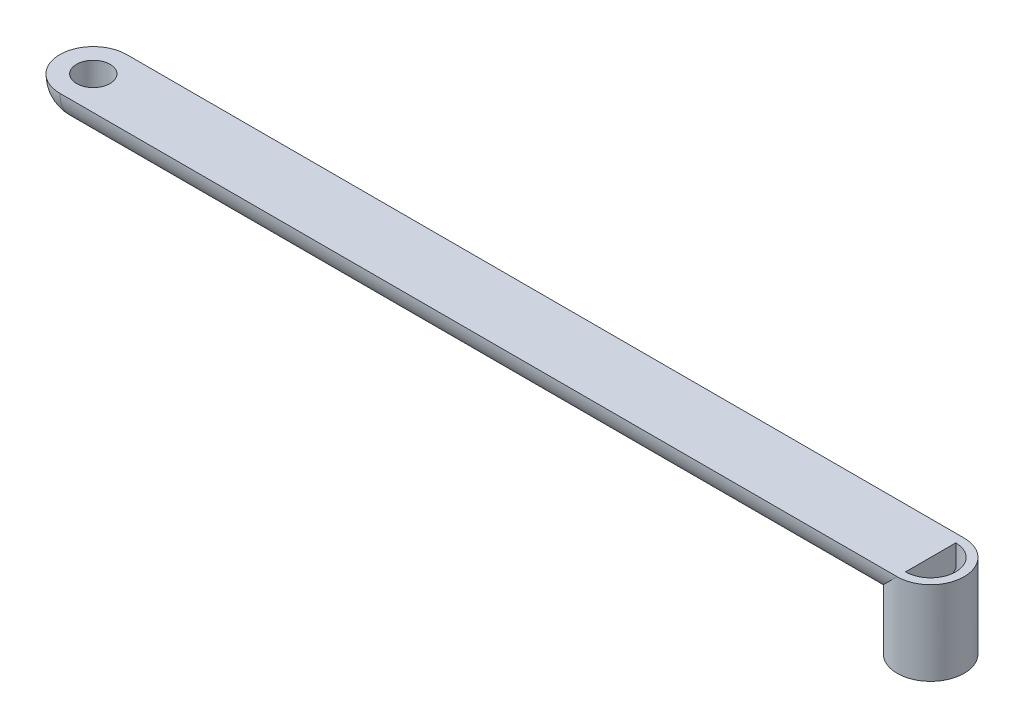
ISO-10303-21;
HEADER;
FILE_DESCRIPTION(('STEP AP214'),'2;1');
FILE_NAME('part.step','',(''),(''),'','','');
FILE_SCHEMA(('AUTOMOTIVE_DESIGN { 1 0 10303 214 1 1 1 1 }'));
ENDSEC;
DATA;
#1=APPLICATION_CONTEXT('core data for automotive mechanical design processes');
#2=APPLICATION_PROTOCOL_DEFINITION('international standard','automotive_design',2000,#1);
#3=PRODUCT_CONTEXT('',#1,'mechanical');
#4=PRODUCT('Part','Part','',(#3));
#5=PRODUCT_RELATED_PRODUCT_CATEGORY('part','',(#4));
#6=PRODUCT_DEFINITION_FORMATION('','',#4);
#7=PRODUCT_DEFINITION_CONTEXT('part definition',#1,'design');
#8=PRODUCT_DEFINITION('design','',#6,#7);
#9=PRODUCT_DEFINITION_SHAPE('','',#8);
#10=(LENGTH_UNIT() NAMED_UNIT(*) SI_UNIT(.MILLI.,.METRE.));
#11=(NAMED_UNIT(*) PLANE_ANGLE_UNIT() SI_UNIT($,.RADIAN.));
#12=(NAMED_UNIT(*) SI_UNIT($,.STERADIAN.) SOLID_ANGLE_UNIT());
#13=UNCERTAINTY_MEASURE_WITH_UNIT(LENGTH_MEASURE(1.E-05),#10,'distance_accuracy_value','');
#14=(GEOMETRIC_REPRESENTATION_CONTEXT(3) GLOBAL_UNCERTAINTY_ASSIGNED_CONTEXT((#13)) GLOBAL_UNIT_ASSIGNED_CONTEXT((#10,
#11,#12)) REPRESENTATION_CONTEXT('',''));
#15=CARTESIAN_POINT('',(0.,0.,0.));
#16=DIRECTION('',(0.,0.,1.));
#17=DIRECTION('',(1.,0.,0.));
#18=AXIS2_PLACEMENT_3D('',#15,#16,#17);
#19=CARTESIAN_POINT('',(0.,50.,0.));
#20=DIRECTION('',(0.,1.,0.));
#21=DIRECTION('',(0.,0.,1.));
#22=AXIS2_PLACEMENT_3D('',#19,#20,#21);
#23=CYLINDRICAL_SURFACE('',#22,20.);
#24=CARTESIAN_POINT('',(0.,0.,0.));
#25=DIRECTION('',(0.,1.,0.));
#26=DIRECTION('',(0.,0.,1.));
#27=AXIS2_PLACEMENT_3D('',#24,#25,#26);
#28=CIRCLE('',#27,20.);
#29=CARTESIAN_POINT('',(0.,0.,20.));
#30=VERTEX_POINT('',#29);
#31=EDGE_CURVE('E163',#30,#30,#28,.T.);
#32=ORIENTED_EDGE('',*,*,#31,.T.);
#33=EDGE_LOOP('',(#32));
#34=FACE_BOUND('',#33,.T.);
#35=CARTESIAN_POINT('',(0.,50.,0.));
#36=DIRECTION('',(-0.707106781186548,0.707106781186547,0.));
#37=DIRECTION('',(0.707106781186547,0.707106781186548,0.));
#38=AXIS2_PLACEMENT_3D('',#35,#36,#37);
#39=ELLIPSE('',#38,28.2842712474619,20.);
#40=CARTESIAN_POINT('',(0.,50.0000000000001,-20.0000000000001));
#41=VERTEX_POINT('',#40);
#42=CARTESIAN_POINT('',(0.,50.,20.));
#43=VERTEX_POINT('',#42);
#44=EDGE_CURVE('E108',#41,#43,#39,.T.);
#45=ORIENTED_EDGE('',*,*,#44,.F.);
#46=CARTESIAN_POINT('',(0.,50.,0.));
#47=DIRECTION('',(0.,1.,0.));
#48=DIRECTION('',(0.,0.,1.));
#49=AXIS2_PLACEMENT_3D('',#46,#47,#48);
#50=CIRCLE('',#49,20.);
#51=EDGE_CURVE('E167',#43,#41,#50,.T.);
#52=ORIENTED_EDGE('',*,*,#51,.F.);
#53=EDGE_LOOP('',(#45,#52));
#54=FACE_BOUND('',#53,.T.);
#55=ADVANCED_FACE('F37',(#34,#54),#23,.T.);
#56=CARTESIAN_POINT('',(0.,50.,0.));
#57=DIRECTION('',(0.,1.,0.));
#58=DIRECTION('',(0.,0.,1.));
#59=AXIS2_PLACEMENT_3D('',#56,#57,#58);
#60=CYLINDRICAL_SURFACE('',#59,15.);
#61=DIRECTION('',(0.,1.,0.));
#62=VECTOR('',#61,1.);
#63=CARTESIAN_POINT('',(0.,50.,-15.));
#64=LINE('',#63,#62);
#65=CARTESIAN_POINT('',(0.,36.771243444677,-15.));
#66=VERTEX_POINT('',#65);
#67=CARTESIAN_POINT('',(0.,50.,-15.));
#68=VERTEX_POINT('',#67);
#69=EDGE_CURVE('E59',#66,#68,#64,.T.);
#70=ORIENTED_EDGE('',*,*,#69,.F.);
#71=CARTESIAN_POINT('',(0.,36.771243444677,-15.));
#72=CARTESIAN_POINT('',(-0.176733878906073,36.7712629463075,-15.0000079735266));
#73=CARTESIAN_POINT('',(-0.353459882850591,36.767702246076,-14.99687673945));
#74=CARTESIAN_POINT('',(-0.706382472485033,36.7535654233469,-14.9843963189759));
#75=CARTESIAN_POINT('',(-0.882579141740371,36.7429904737367,-14.9750481721383));
#76=CARTESIAN_POINT('',(-1.23363053180858,36.7149986117996,-14.9502196912227));
#77=CARTESIAN_POINT('',(-1.40848725636122,36.6975956947333,-14.9347519000172));
#78=CARTESIAN_POINT('',(-1.75677034083064,36.6562252984173,-14.897799857157));
#79=CARTESIAN_POINT('',(-1.93019665769643,36.6322576223254,-14.8763154250947));
#80=CARTESIAN_POINT('',(-2.44328217942834,36.55170322785,-14.8036672501449));
#81=CARTESIAN_POINT('',(-2.78038223865948,36.4860785795133,-14.7439736943787));
#82=CARTESIAN_POINT('',(-3.44519942425923,36.3338208535488,-14.6029534549164));
#83=CARTESIAN_POINT('',(-3.77291196512252,36.2471776982993,-14.5216163921151));
#84=CARTESIAN_POINT('',(-4.41479897701609,36.0573604970292,-14.3394542201581));
#85=CARTESIAN_POINT('',(-4.72906171167426,35.9543262680818,-14.2387925700737));
#86=CARTESIAN_POINT('',(-5.34602691503038,35.7347675133727,-14.0188186022798));
#87=CARTESIAN_POINT('',(-5.64873053468124,35.6182443354017,-13.8995081475079));
#88=CARTESIAN_POINT('',(-6.24332320539639,35.3744989661203,-13.6428058299157));
#89=CARTESIAN_POINT('',(-6.53517016813653,35.2472403518448,-13.5053514389101));
#90=CARTESIAN_POINT('',(-7.10680777867469,34.9852679448747,-13.2134890618355));
#91=CARTESIAN_POINT('',(-7.3865965713478,34.8505530122716,-13.0590784799646));
#92=CARTESIAN_POINT('',(-7.99087229496329,34.5477458698984,-12.7001495410012));
#93=CARTESIAN_POINT('',(-8.31257620714151,34.3785317376843,-12.4918843601087));
#94=CARTESIAN_POINT('',(-8.9380338824212,34.036922223484,-12.052289114329));
#95=CARTESIAN_POINT('',(-9.24178623097383,33.8645265922027,-11.8209572356795));
#96=CARTESIAN_POINT('',(-9.83104386427943,33.5199426311072,-11.3356217900065));
#97=CARTESIAN_POINT('',(-10.1165402170005,33.3477544426034,-11.0816072686079));
#98=CARTESIAN_POINT('',(-10.6683947672444,33.0068369210706,-10.5513878476987));
#99=CARTESIAN_POINT('',(-10.9347513743794,32.8381078763045,-10.2751811081896));
#100=CARTESIAN_POINT('',(-11.4998212871325,32.4731557904509,-9.64205182525309));
#101=CARTESIAN_POINT('',(-11.7939757239875,32.2783864262411,-9.28018943425487));
#102=CARTESIAN_POINT('',(-12.3504681521328,31.9032639452068,-8.52559136582214));
#103=CARTESIAN_POINT('',(-12.6127989675482,31.7229140829347,-8.13284875802294));
#104=CARTESIAN_POINT('',(-13.101960183433,31.3819800349645,-7.31872600131997));
#105=CARTESIAN_POINT('',(-13.3288513408535,31.2213621244934,-6.89739668038329));
#106=CARTESIAN_POINT('',(-13.743906310598,30.9245204394303,-6.02799667662743));
#107=CARTESIAN_POINT('',(-13.9320906161465,30.7882837612595,-5.5799403073097));
#108=CARTESIAN_POINT('',(-14.2155218255108,30.5815873488256,-4.79953907301783));
#109=CARTESIAN_POINT('',(-14.3216773449766,30.5036845773899,-4.47307882444002));
#110=CARTESIAN_POINT('',(-14.5120028402441,30.3634505513707,-3.81057296775454));
#111=CARTESIAN_POINT('',(-14.5961780606442,30.3011155823943,-3.47452966747119));
#112=CARTESIAN_POINT('',(-14.7413793560126,30.1932863941751,-2.79505763114002));
#113=CARTESIAN_POINT('',(-14.8024213570907,30.1477805893843,-2.45163414874145));
#114=CARTESIAN_POINT('',(-14.9005501331646,30.0745056081502,-1.75948027006187));
#115=CARTESIAN_POINT('',(-14.9376360493555,30.0467370675726,-1.41074968398447));
#116=CARTESIAN_POINT('',(-14.987335702051,30.0095032907172,-0.709643323367877));
#117=CARTESIAN_POINT('',(-14.9998847993223,30.0000863998194,-0.357260372584957));
#118=CARTESIAN_POINT('',(-15.0001136184122,29.9999147868796,0.347516865404779));
#119=CARTESIAN_POINT('',(-14.9877934383938,30.0091599911755,0.699911152561359));
#120=CARTESIAN_POINT('',(-14.9384782654607,30.0461064621876,1.40205505403781));
#121=CARTESIAN_POINT('',(-14.9014783982485,30.0738113747395,1.75180413211965));
#122=CARTESIAN_POINT('',(-14.803377765454,30.1470674722445,2.44599532638162));
#123=CARTESIAN_POINT('',(-14.7422771600251,30.1926185386069,2.79043747781131));
#124=CARTESIAN_POINT('',(-14.5993801140693,30.2987387558888,3.4599457294934));
#125=CARTESIAN_POINT('',(-14.5183676329562,30.3587375864787,3.78527081562633));
#126=CARTESIAN_POINT('',(-14.3357363666305,30.4933465351639,4.42695679816696));
#127=CARTESIAN_POINT('',(-14.2341182017195,30.5679562134204,4.74331796409268));
#128=CARTESIAN_POINT('',(-14.0114122857969,30.7304935268366,5.36558937026337));
#129=CARTESIAN_POINT('',(-13.8903232894865,30.8184220138083,5.6714989405358));
#130=CARTESIAN_POINT('',(-13.6298619969652,31.0061854118989,6.27167491763578));
#131=CARTESIAN_POINT('',(-13.4904872074764,31.1060219465176,6.56593972955935));
#132=CARTESIAN_POINT('',(-13.1786248888202,31.3274848578472,7.17304449030048));
#133=CARTESIAN_POINT('',(-13.0041861878223,31.4503000893887,7.48444820743945));
#134=CARTESIAN_POINT('',(-12.6358191012628,31.7066561815177,8.09085688682627));
#135=CARTESIAN_POINT('',(-12.4418895245203,31.8401976975396,8.38586084509282));
#136=CARTESIAN_POINT('',(-12.0357738206923,32.1159955830716,8.95899421930461));
#137=CARTESIAN_POINT('',(-11.8235772678145,32.2582569158593,9.23711384211268));
#138=CARTESIAN_POINT('',(-11.3821605044448,32.5493253559616,9.77587473017112));
#139=CARTESIAN_POINT('',(-11.1529385748191,32.6981331236809,10.0365142252992));
#140=CARTESIAN_POINT('',(-10.6317779192735,33.029829299738,10.5894585457902));
#141=CARTESIAN_POINT('',(-10.3363646309976,33.2136700766106,10.8779255755101));
#142=CARTESIAN_POINT('',(-9.72364948908711,33.5838576285037,11.4289306243139));
#143=CARTESIAN_POINT('',(-9.4063433890214,33.7702048840175,11.6914635889569));
#144=CARTESIAN_POINT('',(-8.75026382444806,34.1414423169824,12.1902786993343));
#145=CARTESIAN_POINT('',(-8.41146747151905,34.3263306968297,12.4265320927569));
#146=CARTESIAN_POINT('',(-7.71314486943709,34.6897521333979,12.8716274622872));
#147=CARTESIAN_POINT('',(-7.35362336556698,34.868286629898,13.0804756775567));
#148=CARTESIAN_POINT('',(-6.6866087676077,35.1796856192033,13.4313823561329));
#149=CARTESIAN_POINT('',(-6.38274940460065,35.3146373989577,13.5785051115813));
#150=CARTESIAN_POINT('',(-5.76184175330657,35.5736623003155,13.8533906597262));
#151=CARTESIAN_POINT('',(-5.44479340437268,35.6977353718873,13.9811533633869));
#152=CARTESIAN_POINT('',(-4.79938040537522,35.9307455472113,14.2156000926108));
#153=CARTESIAN_POINT('',(-4.47107413181974,36.0397492699787,14.3223778347324));
#154=CARTESIAN_POINT('',(-3.80266784504565,36.2392333206624,14.514147506704));
#155=CARTESIAN_POINT('',(-3.4625715785396,36.329719471261,14.5991462868761));
#156=CARTESIAN_POINT('',(-2.8665646375323,36.4664286417922,14.72578013653));
#157=CARTESIAN_POINT('',(-2.61303598520628,36.5179907575124,14.7729180929866));
#158=CARTESIAN_POINT('',(-2.1016185871534,36.6077098491905,14.8542996683176));
#159=CARTESIAN_POINT('',(-1.84373121105964,36.6458709569568,14.8885472617922));
#160=CARTESIAN_POINT('',(-1.32252349260597,36.7078316003608,14.9438987427059));
#161=CARTESIAN_POINT('',(-1.05917543129359,36.731503748805,14.9648860963534));
#162=CARTESIAN_POINT('',(-0.530568679832663,36.7632649744925,14.9929628636197));
#163=CARTESIAN_POINT('',(-0.265308458124138,36.7713397316467,15.0000395058087));
#164=CARTESIAN_POINT('',(0.,36.771243444677,15.));
#165=B_SPLINE_CURVE_WITH_KNOTS('',3,(#71,#72,#73,#74,#75,#76,#77,#78,#79,#80,#81,#82,#83,#84,
#85,#86,#87,#88,#89,#90,#91,#92,#93,#94,#95,#96,#97,#98,#99,#100,#101,#102,#103,#104,#105,#106,
#107,#108,#109,#110,#111,#112,#113,#114,#115,#116,#117,#118,#119,#120,#121,#122,#123,#124,#125,
#126,#127,#128,#129,#130,#131,#132,#133,#134,#135,#136,#137,#138,#139,#140,#141,#142,#143,#144,
#145,#146,#147,#148,#149,#150,#151,#152,#153,#154,#155,#156,#157,#158,#159,#160,#161,#162,#163,
#164),.UNSPECIFIED.,.F.,.F.,(4,2,2,2,2,2,2,2,2,2,2,2,2,2,2,2,2,2,2,2,2,2,2,2,2,2,2,2,2,2,2,2,2,
2,2,2,2,2,2,2,2,2,2,2,2,2,4),(0.,0.530124843038199,1.06016106362168,1.58911649932432,
2.1180877973325,3.16210629169382,4.20662634835101,5.24267226984869,6.278614760764,
7.31822539874029,8.35799541186728,9.61368105309862,10.8694655083892,12.1258597476022,
13.3823582645358,14.8964120882855,16.4108066823381,17.9225758416887,19.4335425274133,
20.4885392857365,21.5432840865818,22.5973014214589,23.6513565398439,24.7081847154544,
25.7650087196039,26.8220415108654,27.8790672780936,28.8997433019992,29.920388604622,
30.9410992107892,31.9619491363287,33.0932783941059,34.2246768349383,35.3567253526752,
36.4888883345694,37.8434598261574,39.198294799359,40.5545978040985,41.9105914902808,
43.0005068424092,44.090427206845,45.1753636074489,46.2599583336944,47.048270176175,
47.8363387519495,48.6312400834306,49.4268708739208),.UNSPECIFIED.);
#166=CARTESIAN_POINT('',(0.,36.771243444677,15.));
#167=VERTEX_POINT('',#166);
#168=EDGE_CURVE('E111',#66,#167,#165,.T.);
#169=ORIENTED_EDGE('',*,*,#168,.T.);
#170=DIRECTION('',(0.,1.,0.));
#171=VECTOR('',#170,1.);
#172=CARTESIAN_POINT('',(0.,50.,15.));
#173=LINE('',#172,#171);
#174=CARTESIAN_POINT('',(0.,50.,15.));
#175=VERTEX_POINT('',#174);
#176=EDGE_CURVE('E99',#175,#167,#173,.F.);
#177=ORIENTED_EDGE('',*,*,#176,.F.);
#178=CARTESIAN_POINT('',(0.,50.,0.));
#179=DIRECTION('',(0.,1.,0.));
#180=DIRECTION('',(0.,0.,1.));
#181=AXIS2_PLACEMENT_3D('',#178,#179,#180);
#182=CIRCLE('',#181,15.);
#183=EDGE_CURVE('E118',#175,#68,#182,.T.);
#184=ORIENTED_EDGE('',*,*,#183,.T.);
#185=EDGE_LOOP('',(#70,#169,#177,#184));
#186=FACE_BOUND('',#185,.T.);
#187=CARTESIAN_POINT('',(0.,0.,0.));
#188=DIRECTION('',(0.,1.,0.));
#189=DIRECTION('',(0.,0.,1.));
#190=AXIS2_PLACEMENT_3D('',#187,#188,#189);
#191=CIRCLE('',#190,15.);
#192=CARTESIAN_POINT('',(0.,0.,15.));
#193=VERTEX_POINT('',#192);
#194=EDGE_CURVE('E46',#193,#193,#191,.T.);
#195=ORIENTED_EDGE('',*,*,#194,.F.);
#196=EDGE_LOOP('',(#195));
#197=FACE_BOUND('',#196,.T.);
#198=ADVANCED_FACE('F39',(#186,#197),#60,.F.);
#199=CARTESIAN_POINT('',(0.,0.,0.));
#200=DIRECTION('',(0.,1.,0.));
#201=DIRECTION('',(0.,0.,1.));
#202=AXIS2_PLACEMENT_3D('',#199,#200,#201);
#203=PLANE('',#202);
#204=ORIENTED_EDGE('',*,*,#31,.F.);
#205=EDGE_LOOP('',(#204));
#206=FACE_BOUND('',#205,.T.);
#207=ORIENTED_EDGE('',*,*,#194,.T.);
#208=EDGE_LOOP('',(#207));
#209=FACE_BOUND('',#208,.T.);
#210=ADVANCED_FACE('F152',(#206,#209),#203,.F.);
#211=CARTESIAN_POINT('',(0.,50.,0.));
#212=DIRECTION('',(0.,-1.,0.));
#213=DIRECTION('',(0.,0.,-1.));
#214=AXIS2_PLACEMENT_3D('',#211,#212,#213);
#215=PLANE('',#214);
#216=CARTESIAN_POINT('',(-500.,50.,0.));
#217=DIRECTION('',(0.,1.,0.));
#218=DIRECTION('',(0.,0.,1.));
#219=AXIS2_PLACEMENT_3D('',#216,#217,#218);
#220=CIRCLE('',#219,9.99999999999998);
#221=CARTESIAN_POINT('',(-500.,50.,9.99999999999998));
#222=VERTEX_POINT('',#221);
#223=EDGE_CURVE('E92',#222,#222,#220,.T.);
#224=ORIENTED_EDGE('',*,*,#223,.F.);
#225=EDGE_LOOP('',(#224));
#226=FACE_BOUND('',#225,.T.);
#227=ORIENTED_EDGE('',*,*,#183,.F.);
#228=DIRECTION('',(0.,0.,1.));
#229=VECTOR('',#228,1.);
#230=CARTESIAN_POINT('',(0.,50.0000000000002,50.));
#231=LINE('',#230,#229);
#232=EDGE_CURVE('E101',#68,#175,#231,.T.);
#233=ORIENTED_EDGE('',*,*,#232,.F.);
#234=EDGE_LOOP('',(#227,#233));
#235=FACE_BOUND('',#234,.T.);
#236=ORIENTED_EDGE('',*,*,#51,.T.);
#237=DIRECTION('',(1.,0.,0.));
#238=VECTOR('',#237,1.);
#239=CARTESIAN_POINT('',(0.,50.0000000000001,-20.0000000000001));
#240=LINE('',#239,#238);
#241=CARTESIAN_POINT('',(-500.,50.,-20.));
#242=VERTEX_POINT('',#241);
#243=EDGE_CURVE('E178',#242,#41,#240,.T.);
#244=ORIENTED_EDGE('',*,*,#243,.F.);
#245=CARTESIAN_POINT('',(-500.,49.9999999999999,0.));
#246=DIRECTION('',(0.,1.,0.));
#247=DIRECTION('',(0.,0.,1.));
#248=AXIS2_PLACEMENT_3D('',#245,#246,#247);
#249=CIRCLE('',#248,20.);
#250=CARTESIAN_POINT('',(-500.,49.9999999999999,20.));
#251=VERTEX_POINT('',#250);
#252=EDGE_CURVE('E91',#242,#251,#249,.T.);
#253=ORIENTED_EDGE('',*,*,#252,.T.);
#254=DIRECTION('',(1.,0.,0.));
#255=VECTOR('',#254,1.);
#256=CARTESIAN_POINT('',(0.,50.0000000000001,20.0000000000001));
#257=LINE('',#256,#255);
#258=EDGE_CURVE('E177',#251,#43,#257,.T.);
#259=ORIENTED_EDGE('',*,*,#258,.T.);
#260=EDGE_LOOP('',(#236,#244,#253,#259));
#261=FACE_BOUND('',#260,.T.);
#262=ADVANCED_FACE('F128',(#226,#235,#261),#215,.F.);
#263=CARTESIAN_POINT('',(0.,50.,0.));
#264=DIRECTION('',(1.,0.,0.));
#265=DIRECTION('',(0.,1.,0.));
#266=AXIS2_PLACEMENT_3D('',#263,#264,#265);
#267=CYLINDRICAL_SURFACE('',#266,20.);
#268=CARTESIAN_POINT('',(-500.,49.9999999999999,0.));
#269=DIRECTION('',(1.,0.,0.));
#270=DIRECTION('',(0.,1.,0.));
#271=AXIS2_PLACEMENT_3D('',#268,#269,#270);
#272=CIRCLE('',#271,20.);
#273=CARTESIAN_POINT('',(-500.,32.6794919243111,9.99999999999996));
#274=VERTEX_POINT('',#273);
#275=EDGE_CURVE('E90',#251,#274,#272,.T.);
#276=ORIENTED_EDGE('',*,*,#275,.T.);
#277=CARTESIAN_POINT('',(-500.,32.6794919243111,9.99999999999998));
#278=CARTESIAN_POINT('',(-499.869051811282,32.6794949358604,10.0000009842124));
#279=CARTESIAN_POINT('',(-499.73812209713,32.6780062939064,9.99742732625386));
#280=CARTESIAN_POINT('',(-499.476538198109,32.6720765567724,9.98714776425289));
#281=CARTESIAN_POINT('',(-499.345883998772,32.6676356206991,9.97944213678537));
#282=CARTESIAN_POINT('',(-498.954891273438,32.6499403583364,9.94866974837695));
#283=CARTESIAN_POINT('',(-498.695300981241,32.6323134750299,9.91794741881241));
#284=CARTESIAN_POINT('',(-498.18180403485,32.5861904155684,9.83673629740468));
#285=CARTESIAN_POINT('',(-497.927873332549,32.5577571154028,9.78636180553135));
#286=CARTESIAN_POINT('',(-497.425878337959,32.4910251137871,9.66646257715092));
#287=CARTESIAN_POINT('',(-497.177814723062,32.4527252791947,9.59693564097865));
#288=CARTESIAN_POINT('',(-496.689709508798,32.3676320454643,9.4396801648658));
#289=CARTESIAN_POINT('',(-496.449650116678,32.3208592118166,9.35199562450872));
#290=CARTESIAN_POINT('',(-495.978165484807,32.22017892349,9.15913679566111));
#291=CARTESIAN_POINT('',(-495.746743640962,32.1662686998021,9.05395571516241));
#292=CARTESIAN_POINT('',(-495.066681423949,31.9959704891028,8.7131797976528));
#293=CARTESIAN_POINT('',(-494.632519977552,31.8710658548499,8.4524420310276));
#294=CARTESIAN_POINT('',(-493.776765603735,31.6002663996642,7.84654710730719));
#295=CARTESIAN_POINT('',(-493.359104888229,31.4534903548212,7.49622958837881));
#296=CARTESIAN_POINT('',(-492.77914764027,31.2354409979818,6.92338914550209));
#297=CARTESIAN_POINT('',(-492.593483414635,31.1630660583375,6.72441003875209));
#298=CARTESIAN_POINT('',(-492.238627390106,31.0207355255137,6.31150716738825));
#299=CARTESIAN_POINT('',(-492.069429645124,30.9507790649431,6.09758884564932));
#300=CARTESIAN_POINT('',(-491.737632513399,30.8103514720671,5.64077173064866));
#301=CARTESIAN_POINT('',(-491.576260944162,30.7401678358448,5.39689141389571));
#302=CARTESIAN_POINT('',(-491.274796784082,30.606420658317,4.89455061133216));
#303=CARTESIAN_POINT('',(-491.13470542006,30.5428574987541,4.63608928609078));
#304=CARTESIAN_POINT('',(-490.877253080332,30.4242123381422,4.1063567704925));
#305=CARTESIAN_POINT('',(-490.759881255945,30.3691262918227,3.83509177129906));
#306=CARTESIAN_POINT('',(-490.549137810231,30.2690550475659,3.28159507983375));
#307=CARTESIAN_POINT('',(-490.455763637626,30.2240687759487,2.99936455702265));
#308=CARTESIAN_POINT('',(-490.299971819808,30.1483941887775,2.44661833360222));
#309=CARTESIAN_POINT('',(-490.235824344701,30.1169163251358,2.17669780598384));
#310=CARTESIAN_POINT('',(-490.130070884111,30.0647704237154,1.63144213832663));
#311=CARTESIAN_POINT('',(-490.088463919194,30.0441019162486,1.35610723409278));
#312=CARTESIAN_POINT('',(-490.028361031844,30.0141824212622,0.802445521603437));
#313=CARTESIAN_POINT('',(-490.009853708621,30.0049258014519,0.524120257703815));
#314=CARTESIAN_POINT('',(-489.996171294722,29.998086359868,-0.0332395851752107));
#315=CARTESIAN_POINT('',(-490.00099477679,30.0005028239965,-0.312274119721436));
#316=CARTESIAN_POINT('',(-490.032464100389,30.0162161668635,-0.844367806078208));
#317=CARTESIAN_POINT('',(-490.057173019377,30.0285472276153,-1.09757294060551));
#318=CARTESIAN_POINT('',(-490.125684115406,30.0625671535068,-1.60073183471952));
#319=CARTESIAN_POINT('',(-490.169484948119,30.0842553597761,-1.85068582195497));
#320=CARTESIAN_POINT('',(-490.275702507222,30.1364699652473,-2.34565858124275));
#321=CARTESIAN_POINT('',(-490.338119484998,30.1669964837983,-2.59067728660309));
#322=CARTESIAN_POINT('',(-490.48093253157,30.236175795492,-3.07423528621691));
#323=CARTESIAN_POINT('',(-490.561329245032,30.2748288800113,-3.31277434779748));
#324=CARTESIAN_POINT('',(-490.740571388394,30.3599717857382,-3.78518954169201));
#325=CARTESIAN_POINT('',(-490.83965255813,30.4065609152287,-4.0189583384833));
#326=CARTESIAN_POINT('',(-491.054686888776,30.5061656561041,-4.47722056603933));
#327=CARTESIAN_POINT('',(-491.170646030012,30.5591835442576,-4.70171067275902));
#328=CARTESIAN_POINT('',(-491.542510567488,30.7261880607931,-5.3595131586515));
#329=CARTESIAN_POINT('',(-491.822509352858,30.8481776221266,-5.77743531530482));
#330=CARTESIAN_POINT('',(-492.469018111232,31.115584151285,-6.60182721893077));
#331=CARTESIAN_POINT('',(-492.841201200031,31.2621255922754,-7.00348722464226));
#332=CARTESIAN_POINT('',(-493.444570924804,31.4813996942665,-7.55652262572433));
#333=CARTESIAN_POINT('',(-493.653396286568,31.5544599679679,-7.73274718812839));
#334=CARTESIAN_POINT('',(-494.085293192426,31.6985709639122,-8.06789407393764));
#335=CARTESIAN_POINT('',(-494.30836691974,31.7696213757743,-8.22681373564497));
#336=CARTESIAN_POINT('',(-494.782502042699,31.9122159291154,-8.53597765279313));
#337=CARTESIAN_POINT('',(-495.034440575752,31.9834960591662,-8.68500029231327));
#338=CARTESIAN_POINT('',(-495.551772124012,32.1191587562354,-8.96097966642787));
#339=CARTESIAN_POINT('',(-495.817158902972,32.1835444779919,-9.08794650998952));
#340=CARTESIAN_POINT('',(-496.35938711412,32.3029872042067,-9.31839935335128));
#341=CARTESIAN_POINT('',(-496.636206944118,32.3580608825876,-9.42192743721449));
#342=CARTESIAN_POINT('',(-497.199733190566,32.4567769897936,-9.6044848900181));
#343=CARTESIAN_POINT('',(-497.486435263152,32.5004243704686,-9.6835248741758));
#344=CARTESIAN_POINT('',(-497.957958077846,32.5604588282879,-9.79104748365427));
#345=CARTESIAN_POINT('',(-498.140516076512,32.5809232582191,-9.82736239764815));
#346=CARTESIAN_POINT('',(-498.507865417775,32.6162988842342,-9.88980406716619));
#347=CARTESIAN_POINT('',(-498.692656127105,32.6312116184769,-9.91593364474515));
#348=CARTESIAN_POINT('',(-499.064104331508,32.6552157664343,-9.95786509659556));
#349=CARTESIAN_POINT('',(-499.250764491978,32.6642971175905,-9.97364911968099));
#350=CARTESIAN_POINT('',(-499.624946609466,32.6764468977739,-9.99472523916493));
#351=CARTESIAN_POINT('',(-499.812468887454,32.6795128683751,-10.0000130458751));
#352=CARTESIAN_POINT('',(-500.,32.6794919243111,-9.99999999999998));
#353=B_SPLINE_CURVE_WITH_KNOTS('',3,(#277,#278,#279,#280,#281,#282,#283,#284,#285,#286,#287,
#288,#289,#290,#291,#292,#293,#294,#295,#296,#297,#298,#299,#300,#301,#302,#303,#304,#305,#306,
#307,#308,#309,#310,#311,#312,#313,#314,#315,#316,#317,#318,#319,#320,#321,#322,#323,#324,#325,
#326,#327,#328,#329,#330,#331,#332,#333,#334,#335,#336,#337,#338,#339,#340,#341,#342,#343,#344,
#345,#346,#347,#348,#349,#350,#351,#352),.UNSPECIFIED.,.F.,.F.,(4,2,2,2,2,2,2,2,2,2,2,2,2,2,2,2,
2,2,2,2,2,2,2,2,2,2,2,2,2,2,2,2,2,2,2,2,2,4),(0.,0.39277432756564,0.785527489233122,
1.57037135503792,2.35071691709554,3.13115213951756,3.90971788549748,4.68858657241549,
6.24719698095272,7.93328360925694,8.77737560337259,9.62116165389611,10.5222327315746,
11.4233557370876,12.3240473851168,13.2246432376561,14.061163573831,14.8976475585061,
15.7337185344345,16.5697383645887,17.3329555452441,18.096118993782,18.8592927482724,
19.6224938708953,20.396060801028,21.1699024973104,22.7166903951132,24.4095700168371,
25.2573755876402,26.1053113772902,27.0079653719238,27.9102045497694,28.8108106867751,
29.7110258767719,30.272464877369,30.8337482091029,31.3959974995907,31.9584765279149),.UNSPECIFIED.);
#354=CARTESIAN_POINT('',(-500.,32.6794919243111,-9.99999999999996));
#355=VERTEX_POINT('',#354);
#356=EDGE_CURVE('E52',#274,#355,#353,.T.);
#357=ORIENTED_EDGE('',*,*,#356,.T.);
#358=EDGE_CURVE('E87',#355,#242,#272,.T.);
#359=ORIENTED_EDGE('',*,*,#358,.T.);
#360=ORIENTED_EDGE('',*,*,#243,.T.);
#361=ORIENTED_EDGE('',*,*,#44,.T.);
#362=ORIENTED_EDGE('',*,*,#258,.F.);
#363=EDGE_LOOP('',(#276,#357,#359,#360,#361,#362));
#364=FACE_BOUND('',#363,.T.);
#365=ADVANCED_FACE('F86',(#364),#267,.T.);
#366=ORIENTED_EDGE('',*,*,#168,.F.);
#367=CARTESIAN_POINT('',(0.,50.,0.));
#368=DIRECTION('',(1.,0.,0.));
#369=DIRECTION('',(0.,1.,0.));
#370=AXIS2_PLACEMENT_3D('',#367,#368,#369);
#371=CIRCLE('',#370,20.0000000000001);
#372=EDGE_CURVE('E97',#167,#66,#371,.T.);
#373=ORIENTED_EDGE('',*,*,#372,.F.);
#374=EDGE_LOOP('',(#366,#373));
#375=FACE_BOUND('',#374,.T.);
#376=ADVANCED_FACE('F120',(#375),#267,.T.);
#377=CARTESIAN_POINT('',(0.,50.0000000000002,50.));
#378=DIRECTION('',(1.,0.,0.));
#379=DIRECTION('',(0.,1.,0.));
#380=AXIS2_PLACEMENT_3D('',#377,#378,#379);
#381=PLANE('',#380);
#382=ORIENTED_EDGE('',*,*,#372,.T.);
#383=ORIENTED_EDGE('',*,*,#69,.T.);
#384=ORIENTED_EDGE('',*,*,#232,.T.);
#385=ORIENTED_EDGE('',*,*,#176,.T.);
#386=EDGE_LOOP('',(#382,#383,#384,#385));
#387=FACE_BOUND('',#386,.T.);
#388=ADVANCED_FACE('F125',(#387),#381,.T.);
#389=CARTESIAN_POINT('',(-500.,49.9999999999999,0.));
#390=DIRECTION('',(0.,1.,0.));
#391=DIRECTION('',(1.,0.,0.));
#392=AXIS2_PLACEMENT_3D('',#389,#390,#391);
#393=SPHERICAL_SURFACE('',#392,20.);
#394=ORIENTED_EDGE('',*,*,#358,.F.);
#395=CARTESIAN_POINT('',(-500.,32.6794919243111,0.));
#396=DIRECTION('',(0.,1.,0.));
#397=DIRECTION('',(0.,0.,1.));
#398=AXIS2_PLACEMENT_3D('',#395,#396,#397);
#399=CIRCLE('',#398,9.99999999999998);
#400=EDGE_CURVE('E11',#355,#274,#399,.T.);
#401=ORIENTED_EDGE('',*,*,#400,.T.);
#402=ORIENTED_EDGE('',*,*,#275,.F.);
#403=ORIENTED_EDGE('',*,*,#252,.F.);
#404=EDGE_LOOP('',(#394,#401,#402,#403));
#405=FACE_BOUND('',#404,.T.);
#406=ADVANCED_FACE('F94',(#405),#393,.T.);
#407=CARTESIAN_POINT('',(-500.,19.,0.));
#408=DIRECTION('',(0.,1.,0.));
#409=DIRECTION('',(0.,0.,1.));
#410=AXIS2_PLACEMENT_3D('',#407,#408,#409);
#411=CYLINDRICAL_SURFACE('',#410,9.99999999999998);
#412=ORIENTED_EDGE('',*,*,#223,.T.);
#413=EDGE_LOOP('',(#412));
#414=FACE_BOUND('',#413,.T.);
#415=ORIENTED_EDGE('',*,*,#400,.F.);
#416=ORIENTED_EDGE('',*,*,#356,.F.);
#417=EDGE_LOOP('',(#415,#416));
#418=FACE_BOUND('',#417,.T.);
#419=ADVANCED_FACE('F81',(#414,#418),#411,.F.);
#420=CLOSED_SHELL('',(#55,#198,#210,#262,#365,#376,#388,#406,#419));
#421=MANIFOLD_SOLID_BREP('B2',#420);
#422=ADVANCED_BREP_SHAPE_REPRESENTATION('',(#18,#421),#14);
#423=SHAPE_DEFINITION_REPRESENTATION(#9,#422);
ENDSEC;
END-ISO-10303-21;
